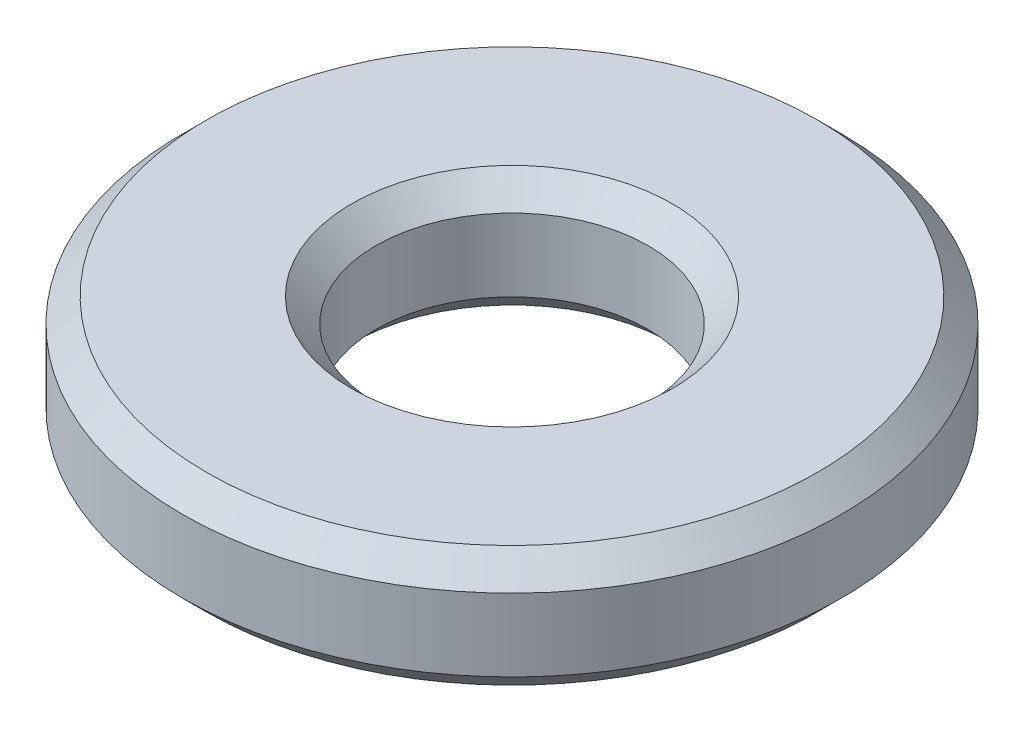
ISO-10303-21;
HEADER;
FILE_DESCRIPTION(('STEP AP214'),'2;1');
FILE_NAME('part.step','',(''),(''),'','','');
FILE_SCHEMA(('AUTOMOTIVE_DESIGN { 1 0 10303 214 1 1 1 1 }'));
ENDSEC;
DATA;
#1=APPLICATION_CONTEXT('core data for automotive mechanical design processes');
#2=APPLICATION_PROTOCOL_DEFINITION('international standard','automotive_design',2000,#1);
#3=PRODUCT_CONTEXT('',#1,'mechanical');
#4=PRODUCT('Part','Part','',(#3));
#5=PRODUCT_RELATED_PRODUCT_CATEGORY('part','',(#4));
#6=PRODUCT_DEFINITION_FORMATION('','',#4);
#7=PRODUCT_DEFINITION_CONTEXT('part definition',#1,'design');
#8=PRODUCT_DEFINITION('design','',#6,#7);
#9=PRODUCT_DEFINITION_SHAPE('','',#8);
#10=(LENGTH_UNIT() NAMED_UNIT(*) SI_UNIT(.MILLI.,.METRE.));
#11=(NAMED_UNIT(*) PLANE_ANGLE_UNIT() SI_UNIT($,.RADIAN.));
#12=(NAMED_UNIT(*) SI_UNIT($,.STERADIAN.) SOLID_ANGLE_UNIT());
#13=UNCERTAINTY_MEASURE_WITH_UNIT(LENGTH_MEASURE(1.E-05),#10,'distance_accuracy_value','');
#14=(GEOMETRIC_REPRESENTATION_CONTEXT(3) GLOBAL_UNCERTAINTY_ASSIGNED_CONTEXT((#13)) GLOBAL_UNIT_ASSIGNED_CONTEXT((#10,
#11,#12)) REPRESENTATION_CONTEXT('',''));
#15=CARTESIAN_POINT('',(0.,0.,0.));
#16=DIRECTION('',(0.,0.,1.));
#17=DIRECTION('',(1.,0.,0.));
#18=AXIS2_PLACEMENT_3D('',#15,#16,#17);
#19=CARTESIAN_POINT('',(0.,2.,0.));
#20=DIRECTION('',(0.,1.,0.));
#21=DIRECTION('',(0.,0.,1.));
#22=AXIS2_PLACEMENT_3D('',#19,#20,#21);
#23=PLANE('',#22);
#24=CARTESIAN_POINT('',(0.,2.,0.));
#25=DIRECTION('',(0.,1.,0.));
#26=DIRECTION('',(0.,0.,1.));
#27=AXIS2_PLACEMENT_3D('',#24,#25,#26);
#28=CIRCLE('',#27,5.05);
#29=CARTESIAN_POINT('',(0.,2.,-5.05));
#30=VERTEX_POINT('',#29);
#31=EDGE_CURVE('E10',#30,#30,#28,.T.);
#32=ORIENTED_EDGE('',*,*,#31,.T.);
#33=EDGE_LOOP('',(#32));
#34=FACE_BOUND('',#33,.T.);
#35=CARTESIAN_POINT('',(0.,2.,0.));
#36=DIRECTION('',(0.,1.,0.));
#37=DIRECTION('',(0.,0.,1.));
#38=AXIS2_PLACEMENT_3D('',#35,#36,#37);
#39=CIRCLE('',#38,2.65);
#40=CARTESIAN_POINT('',(0.,2.,2.65));
#41=VERTEX_POINT('',#40);
#42=EDGE_CURVE('E41',#41,#41,#39,.F.);
#43=ORIENTED_EDGE('',*,*,#42,.T.);
#44=EDGE_LOOP('',(#43));
#45=FACE_BOUND('',#44,.T.);
#46=ADVANCED_FACE('F33',(#34,#45),#23,.T.);
#47=CARTESIAN_POINT('',(0.,0.,0.));
#48=DIRECTION('',(0.,1.,0.));
#49=DIRECTION('',(0.,0.,1.));
#50=AXIS2_PLACEMENT_3D('',#47,#48,#49);
#51=PLANE('',#50);
#52=CARTESIAN_POINT('',(0.,0.,0.));
#53=DIRECTION('',(0.,1.,0.));
#54=DIRECTION('',(0.,0.,1.));
#55=AXIS2_PLACEMENT_3D('',#52,#53,#54);
#56=CIRCLE('',#55,5.05);
#57=CARTESIAN_POINT('',(0.,0.,5.05));
#58=VERTEX_POINT('',#57);
#59=EDGE_CURVE('E54',#58,#58,#56,.F.);
#60=ORIENTED_EDGE('',*,*,#59,.T.);
#61=EDGE_LOOP('',(#60));
#62=FACE_BOUND('',#61,.T.);
#63=CARTESIAN_POINT('',(0.,0.,0.));
#64=DIRECTION('',(0.,1.,0.));
#65=DIRECTION('',(0.,0.,1.));
#66=AXIS2_PLACEMENT_3D('',#63,#64,#65);
#67=CIRCLE('',#66,2.65);
#68=CARTESIAN_POINT('',(0.,0.,2.65));
#69=VERTEX_POINT('',#68);
#70=EDGE_CURVE('E57',#69,#69,#67,.T.);
#71=ORIENTED_EDGE('',*,*,#70,.T.);
#72=EDGE_LOOP('',(#71));
#73=FACE_BOUND('',#72,.T.);
#74=ADVANCED_FACE('F83',(#62,#73),#51,.F.);
#75=CARTESIAN_POINT('',(0.,2.,0.));
#76=DIRECTION('',(0.,-1.,0.));
#77=DIRECTION('',(0.,0.,-1.));
#78=AXIS2_PLACEMENT_3D('',#75,#76,#77);
#79=CYLINDRICAL_SURFACE('',#78,5.45);
#80=CARTESIAN_POINT('',(0.,0.400000000000002,0.));
#81=DIRECTION('',(0.,1.,0.));
#82=DIRECTION('',(0.,0.,1.));
#83=AXIS2_PLACEMENT_3D('',#80,#81,#82);
#84=CIRCLE('',#83,5.45);
#85=CARTESIAN_POINT('',(0.,0.400000000000002,5.45));
#86=VERTEX_POINT('',#85);
#87=EDGE_CURVE('E60',#86,#86,#84,.T.);
#88=ORIENTED_EDGE('',*,*,#87,.T.);
#89=EDGE_LOOP('',(#88));
#90=FACE_BOUND('',#89,.T.);
#91=CARTESIAN_POINT('',(0.,1.6,0.));
#92=DIRECTION('',(0.,1.,0.));
#93=DIRECTION('',(0.,0.,1.));
#94=AXIS2_PLACEMENT_3D('',#91,#92,#93);
#95=CIRCLE('',#94,5.45);
#96=CARTESIAN_POINT('',(0.,1.6,-5.45));
#97=VERTEX_POINT('',#96);
#98=EDGE_CURVE('E63',#97,#97,#95,.F.);
#99=ORIENTED_EDGE('',*,*,#98,.T.);
#100=EDGE_LOOP('',(#99));
#101=FACE_BOUND('',#100,.T.);
#102=ADVANCED_FACE('F67',(#90,#101),#79,.T.);
#103=CARTESIAN_POINT('',(0.,2.,0.));
#104=DIRECTION('',(0.,-1.,0.));
#105=DIRECTION('',(0.,0.,-1.));
#106=AXIS2_PLACEMENT_3D('',#103,#104,#105);
#107=CYLINDRICAL_SURFACE('',#106,2.25);
#108=CARTESIAN_POINT('',(0.,0.400000000000001,0.));
#109=DIRECTION('',(0.,1.,0.));
#110=DIRECTION('',(0.,0.,1.));
#111=AXIS2_PLACEMENT_3D('',#108,#109,#110);
#112=CIRCLE('',#111,2.25);
#113=CARTESIAN_POINT('',(0.,0.400000000000001,2.25));
#114=VERTEX_POINT('',#113);
#115=EDGE_CURVE('E45',#114,#114,#112,.F.);
#116=ORIENTED_EDGE('',*,*,#115,.T.);
#117=EDGE_LOOP('',(#116));
#118=FACE_BOUND('',#117,.T.);
#119=CARTESIAN_POINT('',(0.,1.6,0.));
#120=DIRECTION('',(0.,1.,0.));
#121=DIRECTION('',(0.,0.,1.));
#122=AXIS2_PLACEMENT_3D('',#119,#120,#121);
#123=CIRCLE('',#122,2.25);
#124=CARTESIAN_POINT('',(0.,1.6,2.25));
#125=VERTEX_POINT('',#124);
#126=EDGE_CURVE('E49',#125,#125,#123,.T.);
#127=ORIENTED_EDGE('',*,*,#126,.T.);
#128=EDGE_LOOP('',(#127));
#129=FACE_BOUND('',#128,.T.);
#130=ADVANCED_FACE('F91',(#118,#129),#107,.F.);
#131=CARTESIAN_POINT('',(0.,0.400000000000002,0.));
#132=DIRECTION('',(0.,1.,0.));
#133=DIRECTION('',(0.,0.,1.));
#134=AXIS2_PLACEMENT_3D('',#131,#132,#133);
#135=CONICAL_SURFACE('',#134,5.45,0.785398163397449);
#136=ORIENTED_EDGE('',*,*,#59,.F.);
#137=EDGE_LOOP('',(#136));
#138=FACE_BOUND('',#137,.T.);
#139=ORIENTED_EDGE('',*,*,#87,.F.);
#140=EDGE_LOOP('',(#139));
#141=FACE_BOUND('',#140,.T.);
#142=ADVANCED_FACE('F78',(#138,#141),#135,.T.);
#143=CARTESIAN_POINT('',(0.,0.,0.));
#144=DIRECTION('',(0.,-1.,0.));
#145=DIRECTION('',(0.,0.,-1.));
#146=AXIS2_PLACEMENT_3D('',#143,#144,#145);
#147=CONICAL_SURFACE('',#146,2.65,0.785398163397446);
#148=ORIENTED_EDGE('',*,*,#115,.F.);
#149=EDGE_LOOP('',(#148));
#150=FACE_BOUND('',#149,.T.);
#151=ORIENTED_EDGE('',*,*,#70,.F.);
#152=EDGE_LOOP('',(#151));
#153=FACE_BOUND('',#152,.T.);
#154=ADVANCED_FACE('F72',(#150,#153),#147,.F.);
#155=CARTESIAN_POINT('',(0.,2.,0.));
#156=DIRECTION('',(0.,-1.,0.));
#157=DIRECTION('',(0.,0.,-1.));
#158=AXIS2_PLACEMENT_3D('',#155,#156,#157);
#159=CONICAL_SURFACE('',#158,5.05,0.785398163397448);
#160=CARTESIAN_POINT('',(0.,1.6,-5.45));
#161=CARTESIAN_POINT('',(0.,1.60416666666667,-5.44583333333333));
#162=CARTESIAN_POINT('',(0.,1.60833333333333,-5.44166666666667));
#163=CARTESIAN_POINT('',(0.,1.61666666666667,-5.43333333333333));
#164=CARTESIAN_POINT('',(0.,1.62083333333333,-5.42916666666667));
#165=CARTESIAN_POINT('',(0.,1.62916666666667,-5.42083333333333));
#166=CARTESIAN_POINT('',(0.,1.63333333333333,-5.41666666666667));
#167=CARTESIAN_POINT('',(0.,1.64166666666667,-5.40833333333333));
#168=CARTESIAN_POINT('',(0.,1.64583333333333,-5.40416666666667));
#169=CARTESIAN_POINT('',(0.,1.65416666666667,-5.39583333333333));
#170=CARTESIAN_POINT('',(0.,1.65833333333333,-5.39166666666667));
#171=CARTESIAN_POINT('',(0.,1.66666666666667,-5.38333333333333));
#172=CARTESIAN_POINT('',(0.,1.67083333333333,-5.37916666666667));
#173=CARTESIAN_POINT('',(0.,1.67916666666667,-5.37083333333333));
#174=CARTESIAN_POINT('',(0.,1.68333333333333,-5.36666666666667));
#175=CARTESIAN_POINT('',(0.,1.69166666666667,-5.35833333333333));
#176=CARTESIAN_POINT('',(0.,1.69583333333333,-5.35416666666667));
#177=CARTESIAN_POINT('',(0.,1.70416666666667,-5.34583333333333));
#178=CARTESIAN_POINT('',(0.,1.70833333333333,-5.34166666666667));
#179=CARTESIAN_POINT('',(0.,1.71666666666667,-5.33333333333333));
#180=CARTESIAN_POINT('',(0.,1.72083333333333,-5.32916666666667));
#181=CARTESIAN_POINT('',(0.,1.72916666666667,-5.32083333333333));
#182=CARTESIAN_POINT('',(0.,1.73333333333333,-5.31666666666667));
#183=CARTESIAN_POINT('',(0.,1.74166666666667,-5.30833333333333));
#184=CARTESIAN_POINT('',(0.,1.74583333333333,-5.30416666666667));
#185=CARTESIAN_POINT('',(0.,1.75416666666667,-5.29583333333333));
#186=CARTESIAN_POINT('',(0.,1.75833333333333,-5.29166666666667));
#187=CARTESIAN_POINT('',(0.,1.76666666666667,-5.28333333333333));
#188=CARTESIAN_POINT('',(0.,1.77083333333333,-5.27916666666667));
#189=CARTESIAN_POINT('',(0.,1.77916666666667,-5.27083333333333));
#190=CARTESIAN_POINT('',(0.,1.78333333333333,-5.26666666666667));
#191=CARTESIAN_POINT('',(0.,1.79166666666667,-5.25833333333333));
#192=CARTESIAN_POINT('',(0.,1.79583333333333,-5.25416666666667));
#193=CARTESIAN_POINT('',(0.,1.80416666666667,-5.24583333333333));
#194=CARTESIAN_POINT('',(0.,1.80833333333333,-5.24166666666667));
#195=CARTESIAN_POINT('',(0.,1.81666666666667,-5.23333333333333));
#196=CARTESIAN_POINT('',(0.,1.82083333333333,-5.22916666666667));
#197=CARTESIAN_POINT('',(0.,1.82916666666667,-5.22083333333333));
#198=CARTESIAN_POINT('',(0.,1.83333333333333,-5.21666666666667));
#199=CARTESIAN_POINT('',(0.,1.84166666666667,-5.20833333333333));
#200=CARTESIAN_POINT('',(0.,1.84583333333333,-5.20416666666667));
#201=CARTESIAN_POINT('',(0.,1.85416666666667,-5.19583333333333));
#202=CARTESIAN_POINT('',(0.,1.85833333333333,-5.19166666666667));
#203=CARTESIAN_POINT('',(0.,1.86666666666667,-5.18333333333333));
#204=CARTESIAN_POINT('',(0.,1.87083333333333,-5.17916666666667));
#205=CARTESIAN_POINT('',(0.,1.87916666666667,-5.17083333333333));
#206=CARTESIAN_POINT('',(0.,1.88333333333333,-5.16666666666667));
#207=CARTESIAN_POINT('',(0.,1.89166666666667,-5.15833333333333));
#208=CARTESIAN_POINT('',(0.,1.89583333333333,-5.15416666666667));
#209=CARTESIAN_POINT('',(0.,1.90416666666667,-5.14583333333333));
#210=CARTESIAN_POINT('',(0.,1.90833333333333,-5.14166666666667));
#211=CARTESIAN_POINT('',(0.,1.91666666666667,-5.13333333333333));
#212=CARTESIAN_POINT('',(0.,1.92083333333333,-5.12916666666667));
#213=CARTESIAN_POINT('',(0.,1.92916666666667,-5.12083333333333));
#214=CARTESIAN_POINT('',(0.,1.93333333333333,-5.11666666666667));
#215=CARTESIAN_POINT('',(0.,1.94166666666667,-5.10833333333333));
#216=CARTESIAN_POINT('',(0.,1.94583333333333,-5.10416666666667));
#217=CARTESIAN_POINT('',(0.,1.95416666666667,-5.09583333333333));
#218=CARTESIAN_POINT('',(0.,1.95833333333333,-5.09166666666667));
#219=CARTESIAN_POINT('',(0.,1.96666666666667,-5.08333333333333));
#220=CARTESIAN_POINT('',(0.,1.97083333333333,-5.07916666666667));
#221=CARTESIAN_POINT('',(0.,1.97916666666667,-5.07083333333333));
#222=CARTESIAN_POINT('',(0.,1.98333333333333,-5.06666666666667));
#223=CARTESIAN_POINT('',(0.,1.99166666666667,-5.05833333333333));
#224=CARTESIAN_POINT('',(0.,1.99583333333333,-5.05416666666667));
#225=CARTESIAN_POINT('',(0.,2.,-5.05));
#226=B_SPLINE_CURVE_WITH_KNOTS('',3,(#160,#161,#162,#163,#164,#165,#166,#167,#168,#169,#170,
#171,#172,#173,#174,#175,#176,#177,#178,#179,#180,#181,#182,#183,#184,#185,#186,#187,#188,#189,
#190,#191,#192,#193,#194,#195,#196,#197,#198,#199,#200,#201,#202,#203,#204,#205,#206,#207,#208,
#209,#210,#211,#212,#213,#214,#215,#216,#217,#218,#219,#220,#221,#222,#223,#224,#225),
.UNSPECIFIED.,.F.,.F.,(4,2,2,2,2,2,2,2,2,2,2,2,2,2,2,2,2,2,2,2,2,2,2,2,2,2,2,2,2,2,2,2,4),(0.,
0.0176776695296634,0.0353553390593273,0.0530330085889906,0.0707106781186545,0.0883883476483184,
0.106066017177982,0.123743686707646,0.141421356237309,0.159099025766973,0.176776695296636,
0.1944543648263,0.212132034355963,0.229809703885627,0.247487373415291,0.265165042944955,
0.282842712474619,0.300520382004282,0.318198051533946,0.335875721063609,0.353553390593273,
0.371231060122937,0.3889087296526,0.406586399182264,0.424264068711927,0.441941738241591,
0.459619407771255,0.477297077300919,0.494974746830583,0.512652416360246,0.53033008588991,
0.548007755419573,0.565685424949237),.UNSPECIFIED.);
#227=EDGE_CURVE('BSEAM69',#97,#30,#226,.T.);
#228=ORIENTED_EDGE('',*,*,#98,.F.);
#229=ORIENTED_EDGE('',*,*,#31,.F.);
#230=ORIENTED_EDGE('',*,*,#227,.T.);
#231=ORIENTED_EDGE('',*,*,#227,.F.);
#232=EDGE_LOOP('',(#228,#230,#229,#231));
#233=FACE_BOUND('',#232,.T.);
#234=ADVANCED_FACE('F69',(#233),#159,.T.);
#235=CARTESIAN_POINT('',(0.,1.6,0.));
#236=DIRECTION('',(0.,1.,0.));
#237=DIRECTION('',(0.,0.,1.));
#238=AXIS2_PLACEMENT_3D('',#235,#236,#237);
#239=CONICAL_SURFACE('',#238,2.25,0.78539816339745);
#240=ORIENTED_EDGE('',*,*,#42,.F.);
#241=EDGE_LOOP('',(#240));
#242=FACE_BOUND('',#241,.T.);
#243=ORIENTED_EDGE('',*,*,#126,.F.);
#244=EDGE_LOOP('',(#243));
#245=FACE_BOUND('',#244,.T.);
#246=ADVANCED_FACE('F36',(#242,#245),#239,.F.);
#247=CLOSED_SHELL('',(#46,#74,#102,#130,#142,#154,#234,#246));
#248=MANIFOLD_SOLID_BREP('B2',#247);
#249=ADVANCED_BREP_SHAPE_REPRESENTATION('',(#18,#248),#14);
#250=SHAPE_DEFINITION_REPRESENTATION(#9,#249);
ENDSEC;
END-ISO-10303-21;
